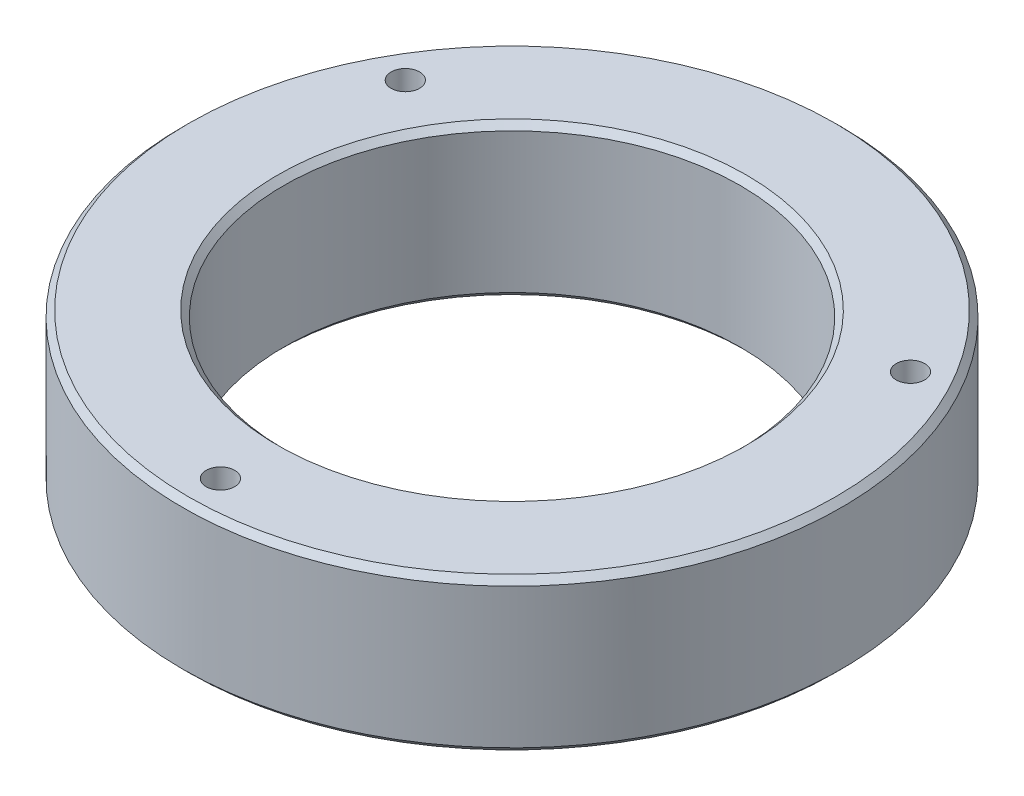
ISO-10303-21;
HEADER;
FILE_DESCRIPTION(('STEP AP214'),'2;1');
FILE_NAME('part.step','',(''),(''),'','','');
FILE_SCHEMA(('AUTOMOTIVE_DESIGN { 1 0 10303 214 1 1 1 1 }'));
ENDSEC;
DATA;
#1=APPLICATION_CONTEXT('core data for automotive mechanical design processes');
#2=APPLICATION_PROTOCOL_DEFINITION('international standard','automotive_design',2000,#1);
#3=PRODUCT_CONTEXT('',#1,'mechanical');
#4=PRODUCT('Part','Part','',(#3));
#5=PRODUCT_RELATED_PRODUCT_CATEGORY('part','',(#4));
#6=PRODUCT_DEFINITION_FORMATION('','',#4);
#7=PRODUCT_DEFINITION_CONTEXT('part definition',#1,'design');
#8=PRODUCT_DEFINITION('design','',#6,#7);
#9=PRODUCT_DEFINITION_SHAPE('','',#8);
#10=(LENGTH_UNIT() NAMED_UNIT(*) SI_UNIT(.MILLI.,.METRE.));
#11=(NAMED_UNIT(*) PLANE_ANGLE_UNIT() SI_UNIT($,.RADIAN.));
#12=(NAMED_UNIT(*) SI_UNIT($,.STERADIAN.) SOLID_ANGLE_UNIT());
#13=UNCERTAINTY_MEASURE_WITH_UNIT(LENGTH_MEASURE(1.E-05),#10,'distance_accuracy_value','');
#14=(GEOMETRIC_REPRESENTATION_CONTEXT(3) GLOBAL_UNCERTAINTY_ASSIGNED_CONTEXT((#13)) GLOBAL_UNIT_ASSIGNED_CONTEXT((#10,
#11,#12)) REPRESENTATION_CONTEXT('',''));
#15=CARTESIAN_POINT('',(0.,0.,0.));
#16=DIRECTION('',(0.,0.,1.));
#17=DIRECTION('',(1.,0.,0.));
#18=AXIS2_PLACEMENT_3D('',#15,#16,#17);
#19=CARTESIAN_POINT('',(-57.15,-19.05,0.));
#20=DIRECTION('',(0.,1.,0.));
#21=DIRECTION('',(0.,0.,1.));
#22=AXIS2_PLACEMENT_3D('',#19,#20,#21);
#23=PLANE('',#22);
#24=CARTESIAN_POINT('',(69.85,-19.05,0.));
#25=DIRECTION('',(0.,1.,0.));
#26=DIRECTION('',(0.,0.,1.));
#27=AXIS2_PLACEMENT_3D('',#24,#25,#26);
#28=CIRCLE('',#27,3.96874999999999);
#29=CARTESIAN_POINT('',(69.85,-19.05,3.96874999999999));
#30=VERTEX_POINT('',#29);
#31=EDGE_CURVE('E119',#30,#30,#28,.T.);
#32=ORIENTED_EDGE('',*,*,#31,.T.);
#33=EDGE_LOOP('',(#32));
#34=FACE_BOUND('',#33,.T.);
#35=CARTESIAN_POINT('',(-69.85,-19.05,0.));
#36=DIRECTION('',(0.,1.,0.));
#37=DIRECTION('',(0.,0.,1.));
#38=AXIS2_PLACEMENT_3D('',#35,#36,#37);
#39=CIRCLE('',#38,3.96874999999999);
#40=CARTESIAN_POINT('',(-69.85,-19.05,3.96874999999999));
#41=VERTEX_POINT('',#40);
#42=EDGE_CURVE('E116',#41,#41,#39,.T.);
#43=ORIENTED_EDGE('',*,*,#42,.T.);
#44=EDGE_LOOP('',(#43));
#45=FACE_BOUND('',#44,.T.);
#46=CARTESIAN_POINT('',(0.,-19.05,73.025));
#47=DIRECTION('',(0.,-1.,0.));
#48=DIRECTION('',(0.,0.,-1.));
#49=AXIS2_PLACEMENT_3D('',#46,#47,#48);
#50=CIRCLE('',#49,5.56259999999999);
#51=CARTESIAN_POINT('',(0.,-19.05,67.4624));
#52=VERTEX_POINT('',#51);
#53=EDGE_CURVE('E109',#52,#52,#50,.T.);
#54=ORIENTED_EDGE('',*,*,#53,.F.);
#55=EDGE_LOOP('',(#54));
#56=FACE_BOUND('',#55,.T.);
#57=CARTESIAN_POINT('',(63.246,-19.05,-36.5252));
#58=DIRECTION('',(0.,-1.,0.));
#59=DIRECTION('',(0.,0.,-1.));
#60=AXIS2_PLACEMENT_3D('',#57,#58,#59);
#61=CIRCLE('',#60,5.5626);
#62=CARTESIAN_POINT('',(63.246,-19.05,-42.0878));
#63=VERTEX_POINT('',#62);
#64=EDGE_CURVE('E97',#63,#63,#61,.T.);
#65=ORIENTED_EDGE('',*,*,#64,.F.);
#66=EDGE_LOOP('',(#65));
#67=FACE_BOUND('',#66,.T.);
#68=CARTESIAN_POINT('',(-63.246,-19.05,-36.5252));
#69=DIRECTION('',(0.,-1.,0.));
#70=DIRECTION('',(0.,0.,-1.));
#71=AXIS2_PLACEMENT_3D('',#68,#69,#70);
#72=CIRCLE('',#71,5.56259999999999);
#73=CARTESIAN_POINT('',(-63.246,-19.05,-42.0878));
#74=VERTEX_POINT('',#73);
#75=EDGE_CURVE('E85',#74,#74,#72,.T.);
#76=ORIENTED_EDGE('',*,*,#75,.F.);
#77=EDGE_LOOP('',(#76));
#78=FACE_BOUND('',#77,.T.);
#79=CARTESIAN_POINT('',(0.,-19.05,0.));
#80=DIRECTION('',(0.,1.,0.));
#81=DIRECTION('',(0.,0.,1.));
#82=AXIS2_PLACEMENT_3D('',#79,#80,#81);
#83=CIRCLE('',#82,58.674);
#84=CARTESIAN_POINT('',(0.,-19.05,-58.674));
#85=VERTEX_POINT('',#84);
#86=EDGE_CURVE('E55',#85,#85,#83,.T.);
#87=ORIENTED_EDGE('',*,*,#86,.T.);
#88=EDGE_LOOP('',(#87));
#89=FACE_BOUND('',#88,.T.);
#90=CARTESIAN_POINT('',(0.,-19.05,0.));
#91=DIRECTION('',(0.,1.,0.));
#92=DIRECTION('',(0.,0.,1.));
#93=AXIS2_PLACEMENT_3D('',#90,#91,#92);
#94=CIRCLE('',#93,81.0006);
#95=CARTESIAN_POINT('',(0.,-19.05,81.0006));
#96=VERTEX_POINT('',#95);
#97=EDGE_CURVE('E59',#96,#96,#94,.F.);
#98=ORIENTED_EDGE('',*,*,#97,.T.);
#99=EDGE_LOOP('',(#98));
#100=FACE_BOUND('',#99,.T.);
#101=ADVANCED_FACE('F43',(#34,#45,#56,#67,#78,#89,#100),#23,.F.);
#102=CARTESIAN_POINT('',(0.,-44.45,0.));
#103=DIRECTION('',(0.,-1.,0.));
#104=DIRECTION('',(0.,0.,-1.));
#105=AXIS2_PLACEMENT_3D('',#102,#103,#104);
#106=CYLINDRICAL_SURFACE('',#105,82.5246);
#107=CARTESIAN_POINT('',(0.,17.526,0.));
#108=DIRECTION('',(0.,-1.,0.));
#109=DIRECTION('',(0.,0.,-1.));
#110=AXIS2_PLACEMENT_3D('',#107,#108,#109);
#111=CIRCLE('',#110,82.5246);
#112=CARTESIAN_POINT('',(0.,17.526,-82.5246));
#113=VERTEX_POINT('',#112);
#114=EDGE_CURVE('E10',#113,#113,#111,.T.);
#115=ORIENTED_EDGE('',*,*,#114,.T.);
#116=EDGE_LOOP('',(#115));
#117=FACE_BOUND('',#116,.T.);
#118=CARTESIAN_POINT('',(0.,-17.526,0.));
#119=DIRECTION('',(0.,1.,0.));
#120=DIRECTION('',(0.,0.,1.));
#121=AXIS2_PLACEMENT_3D('',#118,#119,#120);
#122=CIRCLE('',#121,82.5246);
#123=CARTESIAN_POINT('',(0.,-17.526,82.5246));
#124=VERTEX_POINT('',#123);
#125=EDGE_CURVE('E51',#124,#124,#122,.T.);
#126=ORIENTED_EDGE('',*,*,#125,.T.);
#127=EDGE_LOOP('',(#126));
#128=FACE_BOUND('',#127,.T.);
#129=ADVANCED_FACE('F137',(#117,#128),#106,.T.);
#130=CARTESIAN_POINT('',(-82.5246,19.05,0.));
#131=DIRECTION('',(0.,-1.,0.));
#132=DIRECTION('',(0.,0.,-1.));
#133=AXIS2_PLACEMENT_3D('',#130,#131,#132);
#134=PLANE('',#133);
#135=CARTESIAN_POINT('',(0.,19.05,73.025));
#136=DIRECTION('',(0.,-1.,0.));
#137=DIRECTION('',(0.,0.,-1.));
#138=AXIS2_PLACEMENT_3D('',#135,#136,#137);
#139=CIRCLE('',#138,3.56869999999999);
#140=CARTESIAN_POINT('',(0.,19.05,69.4563));
#141=VERTEX_POINT('',#140);
#142=EDGE_CURVE('E100',#141,#141,#139,.T.);
#143=ORIENTED_EDGE('',*,*,#142,.T.);
#144=EDGE_LOOP('',(#143));
#145=FACE_BOUND('',#144,.T.);
#146=CARTESIAN_POINT('',(63.246,19.05,-36.5252));
#147=DIRECTION('',(0.,-1.,0.));
#148=DIRECTION('',(0.,0.,-1.));
#149=AXIS2_PLACEMENT_3D('',#146,#147,#148);
#150=CIRCLE('',#149,3.56869999999999);
#151=CARTESIAN_POINT('',(63.246,19.05,-40.0939));
#152=VERTEX_POINT('',#151);
#153=EDGE_CURVE('E88',#152,#152,#150,.T.);
#154=ORIENTED_EDGE('',*,*,#153,.T.);
#155=EDGE_LOOP('',(#154));
#156=FACE_BOUND('',#155,.T.);
#157=CARTESIAN_POINT('',(-63.246,19.05,-36.5252));
#158=DIRECTION('',(0.,-1.,0.));
#159=DIRECTION('',(0.,0.,-1.));
#160=AXIS2_PLACEMENT_3D('',#157,#158,#159);
#161=CIRCLE('',#160,3.56869999999999);
#162=CARTESIAN_POINT('',(-63.246,19.05,-40.0939));
#163=VERTEX_POINT('',#162);
#164=EDGE_CURVE('E76',#163,#163,#161,.T.);
#165=ORIENTED_EDGE('',*,*,#164,.T.);
#166=EDGE_LOOP('',(#165));
#167=FACE_BOUND('',#166,.T.);
#168=CARTESIAN_POINT('',(0.,19.05,0.));
#169=DIRECTION('',(0.,-1.,0.));
#170=DIRECTION('',(0.,0.,-1.));
#171=AXIS2_PLACEMENT_3D('',#168,#169,#170);
#172=CIRCLE('',#171,58.674);
#173=CARTESIAN_POINT('',(0.,19.05,-58.674));
#174=VERTEX_POINT('',#173);
#175=EDGE_CURVE('E70',#174,#174,#172,.T.);
#176=ORIENTED_EDGE('',*,*,#175,.T.);
#177=EDGE_LOOP('',(#176));
#178=FACE_BOUND('',#177,.T.);
#179=CARTESIAN_POINT('',(0.,19.05,0.));
#180=DIRECTION('',(0.,-1.,0.));
#181=DIRECTION('',(0.,0.,-1.));
#182=AXIS2_PLACEMENT_3D('',#179,#180,#181);
#183=CIRCLE('',#182,81.0006);
#184=CARTESIAN_POINT('',(0.,19.05,-81.0006));
#185=VERTEX_POINT('',#184);
#186=EDGE_CURVE('E73',#185,#185,#183,.F.);
#187=ORIENTED_EDGE('',*,*,#186,.T.);
#188=EDGE_LOOP('',(#187));
#189=FACE_BOUND('',#188,.T.);
#190=ADVANCED_FACE('F145',(#145,#156,#167,#178,#189),#134,.F.);
#191=CARTESIAN_POINT('',(0.,-44.45,0.));
#192=DIRECTION('',(0.,-1.,0.));
#193=DIRECTION('',(0.,0.,-1.));
#194=AXIS2_PLACEMENT_3D('',#191,#192,#193);
#195=CYLINDRICAL_SURFACE('',#194,57.15);
#196=CARTESIAN_POINT('',(0.,17.526,0.));
#197=DIRECTION('',(0.,-1.,0.));
#198=DIRECTION('',(0.,0.,-1.));
#199=AXIS2_PLACEMENT_3D('',#196,#197,#198);
#200=CIRCLE('',#199,57.15);
#201=CARTESIAN_POINT('',(0.,17.526,-57.15));
#202=VERTEX_POINT('',#201);
#203=EDGE_CURVE('E64',#202,#202,#200,.F.);
#204=CARTESIAN_POINT('',(0.,-17.526,0.));
#205=DIRECTION('',(0.,1.,0.));
#206=DIRECTION('',(0.,0.,1.));
#207=AXIS2_PLACEMENT_3D('',#204,#205,#206);
#208=CIRCLE('',#207,57.15);
#209=CARTESIAN_POINT('',(0.,-17.526,-57.15));
#210=VERTEX_POINT('',#209);
#211=EDGE_CURVE('E67',#210,#210,#208,.F.);
#212=CARTESIAN_POINT('',(0.,17.526,-57.15));
#213=CARTESIAN_POINT('',(0.,17.160875,-57.15));
#214=CARTESIAN_POINT('',(0.,16.79575,-57.15));
#215=CARTESIAN_POINT('',(0.,16.0655,-57.15));
#216=CARTESIAN_POINT('',(0.,15.700375,-57.15));
#217=CARTESIAN_POINT('',(0.,14.970125,-57.15));
#218=CARTESIAN_POINT('',(0.,14.605,-57.15));
#219=CARTESIAN_POINT('',(0.,13.87475,-57.15));
#220=CARTESIAN_POINT('',(0.,13.509625,-57.15));
#221=CARTESIAN_POINT('',(0.,12.779375,-57.15));
#222=CARTESIAN_POINT('',(0.,12.41425,-57.15));
#223=CARTESIAN_POINT('',(0.,11.684,-57.15));
#224=CARTESIAN_POINT('',(0.,11.318875,-57.15));
#225=CARTESIAN_POINT('',(0.,10.588625,-57.15));
#226=CARTESIAN_POINT('',(0.,10.2235,-57.15));
#227=CARTESIAN_POINT('',(0.,9.49324999999998,-57.15));
#228=CARTESIAN_POINT('',(0.,9.12812499999998,-57.15));
#229=CARTESIAN_POINT('',(0.,8.39787499999998,-57.15));
#230=CARTESIAN_POINT('',(0.,8.03274999999998,-57.15));
#231=CARTESIAN_POINT('',(0.,7.30249999999998,-57.15));
#232=CARTESIAN_POINT('',(0.,6.93737499999998,-57.15));
#233=CARTESIAN_POINT('',(0.,6.20712499999998,-57.15));
#234=CARTESIAN_POINT('',(0.,5.84199999999998,-57.15));
#235=CARTESIAN_POINT('',(0.,5.11174999999998,-57.15));
#236=CARTESIAN_POINT('',(0.,4.74662499999998,-57.15));
#237=CARTESIAN_POINT('',(0.,4.01637499999998,-57.15));
#238=CARTESIAN_POINT('',(0.,3.65124999999998,-57.15));
#239=CARTESIAN_POINT('',(0.,2.92099999999998,-57.15));
#240=CARTESIAN_POINT('',(0.,2.55587499999998,-57.15));
#241=CARTESIAN_POINT('',(0.,1.82562499999998,-57.15));
#242=CARTESIAN_POINT('',(0.,1.46049999999998,-57.15));
#243=CARTESIAN_POINT('',(0.,0.730249999999976,-57.15));
#244=CARTESIAN_POINT('',(0.,0.365124999999978,-57.15));
#245=CARTESIAN_POINT('',(0.,-0.365125000000019,-57.15));
#246=CARTESIAN_POINT('',(0.,-0.730250000000018,-57.15));
#247=CARTESIAN_POINT('',(0.,-1.46050000000002,-57.15));
#248=CARTESIAN_POINT('',(0.,-1.82562500000002,-57.15));
#249=CARTESIAN_POINT('',(0.,-2.55587500000002,-57.15));
#250=CARTESIAN_POINT('',(0.,-2.92100000000002,-57.15));
#251=CARTESIAN_POINT('',(0.,-3.65125000000002,-57.15));
#252=CARTESIAN_POINT('',(0.,-4.01637500000002,-57.15));
#253=CARTESIAN_POINT('',(0.,-4.74662500000002,-57.15));
#254=CARTESIAN_POINT('',(0.,-5.11175000000002,-57.15));
#255=CARTESIAN_POINT('',(0.,-5.84200000000002,-57.15));
#256=CARTESIAN_POINT('',(0.,-6.20712500000002,-57.15));
#257=CARTESIAN_POINT('',(0.,-6.93737500000002,-57.15));
#258=CARTESIAN_POINT('',(0.,-7.30250000000002,-57.15));
#259=CARTESIAN_POINT('',(0.,-8.03275000000002,-57.15));
#260=CARTESIAN_POINT('',(0.,-8.39787500000002,-57.15));
#261=CARTESIAN_POINT('',(0.,-9.12812500000002,-57.15));
#262=CARTESIAN_POINT('',(0.,-9.49325000000002,-57.15));
#263=CARTESIAN_POINT('',(0.,-10.2235,-57.15));
#264=CARTESIAN_POINT('',(0.,-10.588625,-57.15));
#265=CARTESIAN_POINT('',(0.,-11.318875,-57.15));
#266=CARTESIAN_POINT('',(0.,-11.684,-57.15));
#267=CARTESIAN_POINT('',(0.,-12.41425,-57.15));
#268=CARTESIAN_POINT('',(0.,-12.779375,-57.15));
#269=CARTESIAN_POINT('',(0.,-13.509625,-57.15));
#270=CARTESIAN_POINT('',(0.,-13.87475,-57.15));
#271=CARTESIAN_POINT('',(0.,-14.605,-57.15));
#272=CARTESIAN_POINT('',(0.,-14.970125,-57.15));
#273=CARTESIAN_POINT('',(0.,-15.700375,-57.15));
#274=CARTESIAN_POINT('',(0.,-16.0655,-57.15));
#275=CARTESIAN_POINT('',(0.,-16.79575,-57.15));
#276=CARTESIAN_POINT('',(0.,-17.160875,-57.15));
#277=CARTESIAN_POINT('',(0.,-17.526,-57.15));
#278=B_SPLINE_CURVE_WITH_KNOTS('',3,(#212,#213,#214,#215,#216,#217,#218,#219,#220,#221,#222,
#223,#224,#225,#226,#227,#228,#229,#230,#231,#232,#233,#234,#235,#236,#237,#238,#239,#240,#241,
#242,#243,#244,#245,#246,#247,#248,#249,#250,#251,#252,#253,#254,#255,#256,#257,#258,#259,#260,
#261,#262,#263,#264,#265,#266,#267,#268,#269,#270,#271,#272,#273,#274,#275,#276,#277),
.UNSPECIFIED.,.F.,.F.,(4,2,2,2,2,2,2,2,2,2,2,2,2,2,2,2,2,2,2,2,2,2,2,2,2,2,2,2,2,2,2,2,4),(0.,
1.095375,2.19075,3.286125,4.3815,5.476875,6.57225,7.667625,8.763,9.858375,10.95375,12.049125,
13.1445,14.239875,15.33525,16.430625,17.526,18.621375,19.71675,20.812125,21.9075,23.002875,
24.09825,25.193625,26.289,27.384375,28.47975,29.575125,30.6705,31.765875,32.86125,33.956625,
35.052),.UNSPECIFIED.);
#279=EDGE_CURVE('BSEAM158',#202,#210,#278,.T.);
#280=ORIENTED_EDGE('',*,*,#203,.T.);
#281=ORIENTED_EDGE('',*,*,#211,.T.);
#282=ORIENTED_EDGE('',*,*,#279,.T.);
#283=ORIENTED_EDGE('',*,*,#279,.F.);
#284=EDGE_LOOP('',(#280,#282,#281,#283));
#285=FACE_BOUND('',#284,.T.);
#286=ADVANCED_FACE('F158',(#285),#195,.F.);
#287=CARTESIAN_POINT('',(0.,19.05,0.));
#288=DIRECTION('',(0.,1.,0.));
#289=DIRECTION('',(0.,0.,1.));
#290=AXIS2_PLACEMENT_3D('',#287,#288,#289);
#291=CONICAL_SURFACE('',#290,58.674,0.785398163397435);
#292=ORIENTED_EDGE('',*,*,#203,.F.);
#293=EDGE_LOOP('',(#292));
#294=FACE_BOUND('',#293,.T.);
#295=ORIENTED_EDGE('',*,*,#175,.F.);
#296=EDGE_LOOP('',(#295));
#297=FACE_BOUND('',#296,.T.);
#298=ADVANCED_FACE('F151',(#294,#297),#291,.F.);
#299=CARTESIAN_POINT('',(0.,-17.526,0.));
#300=DIRECTION('',(0.,-1.,0.));
#301=DIRECTION('',(0.,0.,-1.));
#302=AXIS2_PLACEMENT_3D('',#299,#300,#301);
#303=CONICAL_SURFACE('',#302,57.15,0.785398163397451);
#304=CARTESIAN_POINT('',(0.,-19.05,-58.674));
#305=CARTESIAN_POINT('',(0.,-19.034125,-58.658125));
#306=CARTESIAN_POINT('',(0.,-19.01825,-58.64225));
#307=CARTESIAN_POINT('',(0.,-18.9865,-58.6105));
#308=CARTESIAN_POINT('',(0.,-18.970625,-58.594625));
#309=CARTESIAN_POINT('',(0.,-18.938875,-58.562875));
#310=CARTESIAN_POINT('',(0.,-18.923,-58.547));
#311=CARTESIAN_POINT('',(0.,-18.89125,-58.51525));
#312=CARTESIAN_POINT('',(0.,-18.875375,-58.499375));
#313=CARTESIAN_POINT('',(0.,-18.843625,-58.467625));
#314=CARTESIAN_POINT('',(0.,-18.82775,-58.45175));
#315=CARTESIAN_POINT('',(0.,-18.796,-58.42));
#316=CARTESIAN_POINT('',(0.,-18.780125,-58.404125));
#317=CARTESIAN_POINT('',(0.,-18.748375,-58.372375));
#318=CARTESIAN_POINT('',(0.,-18.7325,-58.3565));
#319=CARTESIAN_POINT('',(0.,-18.70075,-58.32475));
#320=CARTESIAN_POINT('',(0.,-18.684875,-58.308875));
#321=CARTESIAN_POINT('',(0.,-18.653125,-58.277125));
#322=CARTESIAN_POINT('',(0.,-18.63725,-58.26125));
#323=CARTESIAN_POINT('',(0.,-18.6055,-58.2295));
#324=CARTESIAN_POINT('',(0.,-18.589625,-58.213625));
#325=CARTESIAN_POINT('',(0.,-18.557875,-58.181875));
#326=CARTESIAN_POINT('',(0.,-18.542,-58.166));
#327=CARTESIAN_POINT('',(0.,-18.51025,-58.13425));
#328=CARTESIAN_POINT('',(0.,-18.494375,-58.118375));
#329=CARTESIAN_POINT('',(0.,-18.462625,-58.086625));
#330=CARTESIAN_POINT('',(0.,-18.44675,-58.07075));
#331=CARTESIAN_POINT('',(0.,-18.415,-58.039));
#332=CARTESIAN_POINT('',(0.,-18.399125,-58.023125));
#333=CARTESIAN_POINT('',(0.,-18.367375,-57.991375));
#334=CARTESIAN_POINT('',(0.,-18.3515,-57.9755));
#335=CARTESIAN_POINT('',(0.,-18.31975,-57.94375));
#336=CARTESIAN_POINT('',(0.,-18.303875,-57.927875));
#337=CARTESIAN_POINT('',(0.,-18.272125,-57.896125));
#338=CARTESIAN_POINT('',(0.,-18.25625,-57.88025));
#339=CARTESIAN_POINT('',(0.,-18.2245,-57.8485));
#340=CARTESIAN_POINT('',(0.,-18.208625,-57.832625));
#341=CARTESIAN_POINT('',(0.,-18.176875,-57.800875));
#342=CARTESIAN_POINT('',(0.,-18.161,-57.785));
#343=CARTESIAN_POINT('',(0.,-18.12925,-57.75325));
#344=CARTESIAN_POINT('',(0.,-18.113375,-57.737375));
#345=CARTESIAN_POINT('',(0.,-18.081625,-57.705625));
#346=CARTESIAN_POINT('',(0.,-18.06575,-57.68975));
#347=CARTESIAN_POINT('',(0.,-18.034,-57.658));
#348=CARTESIAN_POINT('',(0.,-18.018125,-57.642125));
#349=CARTESIAN_POINT('',(0.,-17.986375,-57.610375));
#350=CARTESIAN_POINT('',(0.,-17.9705,-57.5945));
#351=CARTESIAN_POINT('',(0.,-17.93875,-57.56275));
#352=CARTESIAN_POINT('',(0.,-17.922875,-57.546875));
#353=CARTESIAN_POINT('',(0.,-17.891125,-57.515125));
#354=CARTESIAN_POINT('',(0.,-17.87525,-57.49925));
#355=CARTESIAN_POINT('',(0.,-17.8435,-57.4675));
#356=CARTESIAN_POINT('',(0.,-17.827625,-57.451625));
#357=CARTESIAN_POINT('',(0.,-17.795875,-57.419875));
#358=CARTESIAN_POINT('',(0.,-17.78,-57.404));
#359=CARTESIAN_POINT('',(0.,-17.74825,-57.37225));
#360=CARTESIAN_POINT('',(0.,-17.732375,-57.356375));
#361=CARTESIAN_POINT('',(0.,-17.700625,-57.324625));
#362=CARTESIAN_POINT('',(0.,-17.68475,-57.30875));
#363=CARTESIAN_POINT('',(0.,-17.653,-57.277));
#364=CARTESIAN_POINT('',(0.,-17.637125,-57.261125));
#365=CARTESIAN_POINT('',(0.,-17.605375,-57.229375));
#366=CARTESIAN_POINT('',(0.,-17.5895,-57.2135));
#367=CARTESIAN_POINT('',(0.,-17.55775,-57.18175));
#368=CARTESIAN_POINT('',(0.,-17.541875,-57.165875));
#369=CARTESIAN_POINT('',(0.,-17.526,-57.15));
#370=B_SPLINE_CURVE_WITH_KNOTS('',3,(#304,#305,#306,#307,#308,#309,#310,#311,#312,#313,#314,
#315,#316,#317,#318,#319,#320,#321,#322,#323,#324,#325,#326,#327,#328,#329,#330,#331,#332,#333,
#334,#335,#336,#337,#338,#339,#340,#341,#342,#343,#344,#345,#346,#347,#348,#349,#350,#351,#352,
#353,#354,#355,#356,#357,#358,#359,#360,#361,#362,#363,#364,#365,#366,#367,#368,#369),
.UNSPECIFIED.,.F.,.F.,(4,2,2,2,2,2,2,2,2,2,2,2,2,2,2,2,2,2,2,2,2,2,2,2,2,2,2,2,2,2,2,2,4),(0.,
0.0673519209080149,0.134703841816037,0.202055762724052,0.269407683632072,0.336759604540087,
0.404111525448106,0.471463446356126,0.538815367264141,0.606167288172161,0.673519209080176,
0.740871129988195,0.80822305089621,0.87557497180423,0.94292689271225,1.01027881362026,
1.07763073452828,1.1449826554363,1.21233457634432,1.27968649725234,1.34703841816036,
1.41439033906838,1.48174225997639,1.54909418088441,1.61644610179242,1.68379802270044,
1.75114994360846,1.81850186451648,1.88585378542449,1.95320570633251,2.02055762724053,
2.08790954814855,2.15526146905657),.UNSPECIFIED.);
#371=EDGE_CURVE('BSEAM157',#85,#210,#370,.T.);
#372=ORIENTED_EDGE('',*,*,#86,.F.);
#373=ORIENTED_EDGE('',*,*,#211,.F.);
#374=ORIENTED_EDGE('',*,*,#371,.T.);
#375=ORIENTED_EDGE('',*,*,#371,.F.);
#376=EDGE_LOOP('',(#372,#374,#373,#375));
#377=FACE_BOUND('',#376,.T.);
#378=ADVANCED_FACE('F157',(#377),#303,.F.);
#379=CARTESIAN_POINT('',(0.,17.526,0.));
#380=DIRECTION('',(0.,-1.,0.));
#381=DIRECTION('',(0.,0.,-1.));
#382=AXIS2_PLACEMENT_3D('',#379,#380,#381);
#383=CONICAL_SURFACE('',#382,82.5246,0.785398163397451);
#384=ORIENTED_EDGE('',*,*,#186,.F.);
#385=EDGE_LOOP('',(#384));
#386=FACE_BOUND('',#385,.T.);
#387=ORIENTED_EDGE('',*,*,#114,.F.);
#388=EDGE_LOOP('',(#387));
#389=FACE_BOUND('',#388,.T.);
#390=ADVANCED_FACE('F164',(#386,#389),#383,.T.);
#391=CARTESIAN_POINT('',(0.,-19.05,0.));
#392=DIRECTION('',(0.,1.,0.));
#393=DIRECTION('',(0.,0.,1.));
#394=AXIS2_PLACEMENT_3D('',#391,#392,#393);
#395=CONICAL_SURFACE('',#394,81.0006,0.785398163397448);
#396=ORIENTED_EDGE('',*,*,#125,.F.);
#397=EDGE_LOOP('',(#396));
#398=FACE_BOUND('',#397,.T.);
#399=ORIENTED_EDGE('',*,*,#97,.F.);
#400=EDGE_LOOP('',(#399));
#401=FACE_BOUND('',#400,.T.);
#402=ADVANCED_FACE('F46',(#398,#401),#395,.T.);
#403=CARTESIAN_POINT('',(-63.246,-19.05,-36.5252));
#404=DIRECTION('',(0.,-1.,0.));
#405=DIRECTION('',(0.,0.,-1.));
#406=AXIS2_PLACEMENT_3D('',#403,#404,#405);
#407=CYLINDRICAL_SURFACE('',#406,3.56869999999999);
#408=ORIENTED_EDGE('',*,*,#164,.F.);
#409=EDGE_LOOP('',(#408));
#410=FACE_BOUND('',#409,.T.);
#411=CARTESIAN_POINT('',(-63.246,-9.39800000000001,-36.5252));
#412=DIRECTION('',(0.,-1.,0.));
#413=DIRECTION('',(0.,0.,-1.));
#414=AXIS2_PLACEMENT_3D('',#411,#412,#413);
#415=CIRCLE('',#414,3.56869999999999);
#416=CARTESIAN_POINT('',(-63.246,-9.39800000000001,-40.0939));
#417=VERTEX_POINT('',#416);
#418=EDGE_CURVE('E79',#417,#417,#415,.T.);
#419=ORIENTED_EDGE('',*,*,#418,.T.);
#420=EDGE_LOOP('',(#419));
#421=FACE_BOUND('',#420,.T.);
#422=ADVANCED_FACE('F173',(#410,#421),#407,.F.);
#423=CARTESIAN_POINT('',(-59.6773,-9.398,-36.5252));
#424=DIRECTION('',(0.,1.,0.));
#425=DIRECTION('',(0.,0.,1.));
#426=AXIS2_PLACEMENT_3D('',#423,#424,#425);
#427=PLANE('',#426);
#428=ORIENTED_EDGE('',*,*,#418,.F.);
#429=EDGE_LOOP('',(#428));
#430=FACE_BOUND('',#429,.T.);
#431=CARTESIAN_POINT('',(-63.246,-9.398,-36.5252));
#432=DIRECTION('',(0.,-1.,0.));
#433=DIRECTION('',(0.,0.,-1.));
#434=AXIS2_PLACEMENT_3D('',#431,#432,#433);
#435=CIRCLE('',#434,5.56259999999999);
#436=CARTESIAN_POINT('',(-63.246,-9.398,-42.0878));
#437=VERTEX_POINT('',#436);
#438=EDGE_CURVE('E82',#437,#437,#435,.T.);
#439=ORIENTED_EDGE('',*,*,#438,.T.);
#440=EDGE_LOOP('',(#439));
#441=FACE_BOUND('',#440,.T.);
#442=ADVANCED_FACE('F189',(#430,#441),#427,.F.);
#443=CARTESIAN_POINT('',(-63.246,-19.05,-36.5252));
#444=DIRECTION('',(0.,-1.,0.));
#445=DIRECTION('',(0.,0.,-1.));
#446=AXIS2_PLACEMENT_3D('',#443,#444,#445);
#447=CYLINDRICAL_SURFACE('',#446,5.56259999999999);
#448=ORIENTED_EDGE('',*,*,#438,.F.);
#449=EDGE_LOOP('',(#448));
#450=FACE_BOUND('',#449,.T.);
#451=ORIENTED_EDGE('',*,*,#75,.T.);
#452=EDGE_LOOP('',(#451));
#453=FACE_BOUND('',#452,.T.);
#454=ADVANCED_FACE('F193',(#450,#453),#447,.F.);
#455=CARTESIAN_POINT('',(63.246,-19.05,-36.5252));
#456=DIRECTION('',(0.,-1.,0.));
#457=DIRECTION('',(0.,0.,-1.));
#458=AXIS2_PLACEMENT_3D('',#455,#456,#457);
#459=CYLINDRICAL_SURFACE('',#458,3.56869999999999);
#460=ORIENTED_EDGE('',*,*,#153,.F.);
#461=EDGE_LOOP('',(#460));
#462=FACE_BOUND('',#461,.T.);
#463=CARTESIAN_POINT('',(63.246,-9.39800000000001,-36.5252));
#464=DIRECTION('',(0.,-1.,0.));
#465=DIRECTION('',(0.,0.,-1.));
#466=AXIS2_PLACEMENT_3D('',#463,#464,#465);
#467=CIRCLE('',#466,3.56869999999998);
#468=CARTESIAN_POINT('',(63.246,-9.39800000000001,-40.0939));
#469=VERTEX_POINT('',#468);
#470=EDGE_CURVE('E91',#469,#469,#467,.T.);
#471=ORIENTED_EDGE('',*,*,#470,.T.);
#472=EDGE_LOOP('',(#471));
#473=FACE_BOUND('',#472,.T.);
#474=ADVANCED_FACE('F197',(#462,#473),#459,.F.);
#475=CARTESIAN_POINT('',(66.8147,-9.398,-36.5252));
#476=DIRECTION('',(0.,1.,0.));
#477=DIRECTION('',(0.,0.,1.));
#478=AXIS2_PLACEMENT_3D('',#475,#476,#477);
#479=PLANE('',#478);
#480=ORIENTED_EDGE('',*,*,#470,.F.);
#481=EDGE_LOOP('',(#480));
#482=FACE_BOUND('',#481,.T.);
#483=CARTESIAN_POINT('',(63.246,-9.398,-36.5252));
#484=DIRECTION('',(0.,-1.,0.));
#485=DIRECTION('',(0.,0.,-1.));
#486=AXIS2_PLACEMENT_3D('',#483,#484,#485);
#487=CIRCLE('',#486,5.5626);
#488=CARTESIAN_POINT('',(63.246,-9.398,-42.0878));
#489=VERTEX_POINT('',#488);
#490=EDGE_CURVE('E94',#489,#489,#487,.T.);
#491=ORIENTED_EDGE('',*,*,#490,.T.);
#492=EDGE_LOOP('',(#491));
#493=FACE_BOUND('',#492,.T.);
#494=ADVANCED_FACE('F201',(#482,#493),#479,.F.);
#495=CARTESIAN_POINT('',(63.246,-19.05,-36.5252));
#496=DIRECTION('',(0.,-1.,0.));
#497=DIRECTION('',(0.,0.,-1.));
#498=AXIS2_PLACEMENT_3D('',#495,#496,#497);
#499=CYLINDRICAL_SURFACE('',#498,5.5626);
#500=ORIENTED_EDGE('',*,*,#490,.F.);
#501=EDGE_LOOP('',(#500));
#502=FACE_BOUND('',#501,.T.);
#503=ORIENTED_EDGE('',*,*,#64,.T.);
#504=EDGE_LOOP('',(#503));
#505=FACE_BOUND('',#504,.T.);
#506=ADVANCED_FACE('F205',(#502,#505),#499,.F.);
#507=CARTESIAN_POINT('',(0.,-19.05,73.025));
#508=DIRECTION('',(0.,-1.,0.));
#509=DIRECTION('',(0.,0.,-1.));
#510=AXIS2_PLACEMENT_3D('',#507,#508,#509);
#511=CYLINDRICAL_SURFACE('',#510,3.56869999999999);
#512=ORIENTED_EDGE('',*,*,#142,.F.);
#513=EDGE_LOOP('',(#512));
#514=FACE_BOUND('',#513,.T.);
#515=CARTESIAN_POINT('',(0.,-9.39800000000001,73.025));
#516=DIRECTION('',(0.,-1.,0.));
#517=DIRECTION('',(0.,0.,-1.));
#518=AXIS2_PLACEMENT_3D('',#515,#516,#517);
#519=CIRCLE('',#518,3.56869999999999);
#520=CARTESIAN_POINT('',(0.,-9.39800000000001,69.4563));
#521=VERTEX_POINT('',#520);
#522=EDGE_CURVE('E103',#521,#521,#519,.T.);
#523=ORIENTED_EDGE('',*,*,#522,.T.);
#524=EDGE_LOOP('',(#523));
#525=FACE_BOUND('',#524,.T.);
#526=ADVANCED_FACE('F209',(#514,#525),#511,.F.);
#527=CARTESIAN_POINT('',(3.56869999999999,-9.398,73.025));
#528=DIRECTION('',(0.,1.,0.));
#529=DIRECTION('',(0.,0.,1.));
#530=AXIS2_PLACEMENT_3D('',#527,#528,#529);
#531=PLANE('',#530);
#532=ORIENTED_EDGE('',*,*,#522,.F.);
#533=EDGE_LOOP('',(#532));
#534=FACE_BOUND('',#533,.T.);
#535=CARTESIAN_POINT('',(0.,-9.398,73.025));
#536=DIRECTION('',(0.,-1.,0.));
#537=DIRECTION('',(0.,0.,-1.));
#538=AXIS2_PLACEMENT_3D('',#535,#536,#537);
#539=CIRCLE('',#538,5.56259999999999);
#540=CARTESIAN_POINT('',(0.,-9.398,67.4624));
#541=VERTEX_POINT('',#540);
#542=EDGE_CURVE('E106',#541,#541,#539,.T.);
#543=ORIENTED_EDGE('',*,*,#542,.T.);
#544=EDGE_LOOP('',(#543));
#545=FACE_BOUND('',#544,.T.);
#546=ADVANCED_FACE('F213',(#534,#545),#531,.F.);
#547=CARTESIAN_POINT('',(0.,-19.05,73.025));
#548=DIRECTION('',(0.,-1.,0.));
#549=DIRECTION('',(0.,0.,-1.));
#550=AXIS2_PLACEMENT_3D('',#547,#548,#549);
#551=CYLINDRICAL_SURFACE('',#550,5.56259999999999);
#552=ORIENTED_EDGE('',*,*,#542,.F.);
#553=EDGE_LOOP('',(#552));
#554=FACE_BOUND('',#553,.T.);
#555=ORIENTED_EDGE('',*,*,#53,.T.);
#556=EDGE_LOOP('',(#555));
#557=FACE_BOUND('',#556,.T.);
#558=ADVANCED_FACE('F217',(#554,#557),#551,.F.);
#559=CARTESIAN_POINT('',(-69.85,6.35,0.));
#560=DIRECTION('',(0.,-1.,0.));
#561=DIRECTION('',(0.,0.,-1.));
#562=AXIS2_PLACEMENT_3D('',#559,#560,#561);
#563=CYLINDRICAL_SURFACE('',#562,3.96874999999999);
#564=CARTESIAN_POINT('',(-69.85,6.35,0.));
#565=DIRECTION('',(0.,1.,0.));
#566=DIRECTION('',(0.,0.,1.));
#567=AXIS2_PLACEMENT_3D('',#564,#565,#566);
#568=CIRCLE('',#567,3.96874999999999);
#569=CARTESIAN_POINT('',(-69.85,6.35,3.96874999999999));
#570=VERTEX_POINT('',#569);
#571=EDGE_CURVE('E113',#570,#570,#568,.T.);
#572=ORIENTED_EDGE('',*,*,#571,.T.);
#573=EDGE_LOOP('',(#572));
#574=FACE_BOUND('',#573,.T.);
#575=ORIENTED_EDGE('',*,*,#42,.F.);
#576=EDGE_LOOP('',(#575));
#577=FACE_BOUND('',#576,.T.);
#578=ADVANCED_FACE('F220',(#574,#577),#563,.F.);
#579=CARTESIAN_POINT('',(-69.85,6.35,0.));
#580=DIRECTION('',(0.,1.,0.));
#581=DIRECTION('',(0.,0.,1.));
#582=AXIS2_PLACEMENT_3D('',#579,#580,#581);
#583=PLANE('',#582);
#584=ORIENTED_EDGE('',*,*,#571,.F.);
#585=EDGE_LOOP('',(#584));
#586=FACE_BOUND('',#585,.T.);
#587=ADVANCED_FACE('F134',(#586),#583,.F.);
#588=CARTESIAN_POINT('',(69.85,6.35,0.));
#589=DIRECTION('',(0.,-1.,0.));
#590=DIRECTION('',(0.,0.,-1.));
#591=AXIS2_PLACEMENT_3D('',#588,#589,#590);
#592=CYLINDRICAL_SURFACE('',#591,3.96874999999999);
#593=CARTESIAN_POINT('',(69.85,6.35,0.));
#594=DIRECTION('',(0.,1.,0.));
#595=DIRECTION('',(0.,0.,1.));
#596=AXIS2_PLACEMENT_3D('',#593,#594,#595);
#597=CIRCLE('',#596,3.96874999999999);
#598=CARTESIAN_POINT('',(69.85,6.35,3.96874999999999));
#599=VERTEX_POINT('',#598);
#600=EDGE_CURVE('E112',#599,#599,#597,.T.);
#601=ORIENTED_EDGE('',*,*,#600,.T.);
#602=EDGE_LOOP('',(#601));
#603=FACE_BOUND('',#602,.T.);
#604=ORIENTED_EDGE('',*,*,#31,.F.);
#605=EDGE_LOOP('',(#604));
#606=FACE_BOUND('',#605,.T.);
#607=ADVANCED_FACE('F125',(#603,#606),#592,.F.);
#608=CARTESIAN_POINT('',(69.85,6.35,0.));
#609=DIRECTION('',(0.,1.,0.));
#610=DIRECTION('',(0.,0.,1.));
#611=AXIS2_PLACEMENT_3D('',#608,#609,#610);
#612=PLANE('',#611);
#613=ORIENTED_EDGE('',*,*,#600,.F.);
#614=EDGE_LOOP('',(#613));
#615=FACE_BOUND('',#614,.T.);
#616=ADVANCED_FACE('F128',(#615),#612,.F.);
#617=CLOSED_SHELL('',(#101,#129,#190,#286,#298,#378,#390,#402,#422,#442,#454,#474,#494,#506,
#526,#546,#558,#578,#587,#607,#616));
#618=MANIFOLD_SOLID_BREP('B2',#617);
#619=ADVANCED_BREP_SHAPE_REPRESENTATION('',(#18,#618),#14);
#620=SHAPE_DEFINITION_REPRESENTATION(#9,#619);
ENDSEC;
END-ISO-10303-21;
